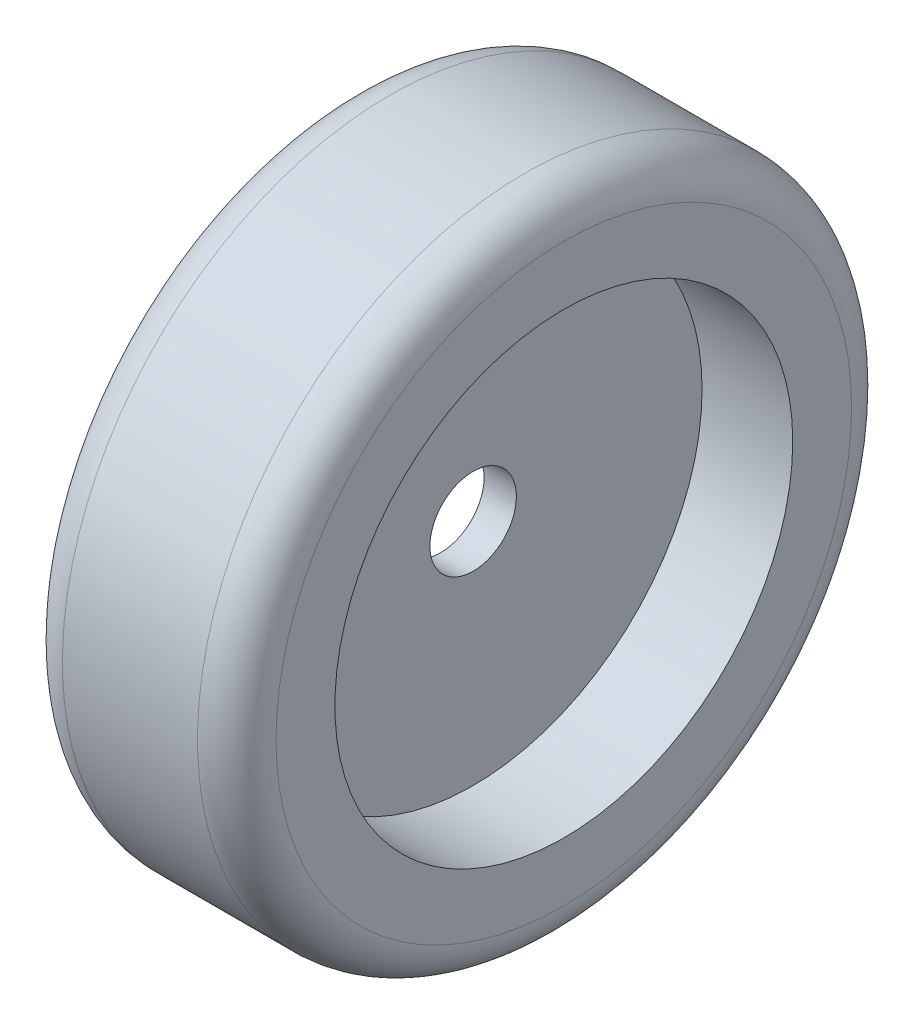
ISO-10303-21;
HEADER;
FILE_DESCRIPTION(('STEP AP214'),'2;1');
FILE_NAME('part.step','',(''),(''),'','','');
FILE_SCHEMA(('AUTOMOTIVE_DESIGN { 1 0 10303 214 1 1 1 1 }'));
ENDSEC;
DATA;
#1=APPLICATION_CONTEXT('core data for automotive mechanical design processes');
#2=APPLICATION_PROTOCOL_DEFINITION('international standard','automotive_design',2000,#1);
#3=PRODUCT_CONTEXT('',#1,'mechanical');
#4=PRODUCT('Part','Part','',(#3));
#5=PRODUCT_RELATED_PRODUCT_CATEGORY('part','',(#4));
#6=PRODUCT_DEFINITION_FORMATION('','',#4);
#7=PRODUCT_DEFINITION_CONTEXT('part definition',#1,'design');
#8=PRODUCT_DEFINITION('design','',#6,#7);
#9=PRODUCT_DEFINITION_SHAPE('','',#8);
#10=(LENGTH_UNIT() NAMED_UNIT(*) SI_UNIT(.MILLI.,.METRE.));
#11=(NAMED_UNIT(*) PLANE_ANGLE_UNIT() SI_UNIT($,.RADIAN.));
#12=(NAMED_UNIT(*) SI_UNIT($,.STERADIAN.) SOLID_ANGLE_UNIT());
#13=UNCERTAINTY_MEASURE_WITH_UNIT(LENGTH_MEASURE(1.E-05),#10,'distance_accuracy_value','');
#14=(GEOMETRIC_REPRESENTATION_CONTEXT(3) GLOBAL_UNCERTAINTY_ASSIGNED_CONTEXT((#13)) GLOBAL_UNIT_ASSIGNED_CONTEXT((#10,
#11,#12)) REPRESENTATION_CONTEXT('',''));
#15=CARTESIAN_POINT('',(0.,0.,0.));
#16=DIRECTION('',(0.,0.,1.));
#17=DIRECTION('',(1.,0.,0.));
#18=AXIS2_PLACEMENT_3D('',#15,#16,#17);
#19=CARTESIAN_POINT('',(82.9564,0.,0.));
#20=DIRECTION('',(-1.,0.,0.));
#21=DIRECTION('',(0.,0.,1.));
#22=AXIS2_PLACEMENT_3D('',#19,#20,#21);
#23=CYLINDRICAL_SURFACE('',#22,16.7894);
#24=CARTESIAN_POINT('',(47.752,0.,0.));
#25=DIRECTION('',(1.,0.,0.));
#26=DIRECTION('',(0.,0.,-1.));
#27=AXIS2_PLACEMENT_3D('',#24,#25,#26);
#28=CIRCLE('',#27,16.7894);
#29=CARTESIAN_POINT('',(47.752,0.,-16.7894));
#30=VERTEX_POINT('',#29);
#31=EDGE_CURVE('E70',#30,#30,#28,.T.);
#32=ORIENTED_EDGE('',*,*,#31,.T.);
#33=EDGE_LOOP('',(#32));
#34=FACE_BOUND('',#33,.T.);
#35=CARTESIAN_POINT('',(35.2044,0.,0.));
#36=DIRECTION('',(1.,0.,0.));
#37=DIRECTION('',(0.,0.,-1.));
#38=AXIS2_PLACEMENT_3D('',#35,#36,#37);
#39=CIRCLE('',#38,16.7894);
#40=CARTESIAN_POINT('',(35.2044,0.,-16.7894));
#41=VERTEX_POINT('',#40);
#42=EDGE_CURVE('E82',#41,#41,#39,.T.);
#43=ORIENTED_EDGE('',*,*,#42,.F.);
#44=EDGE_LOOP('',(#43));
#45=FACE_BOUND('',#44,.T.);
#46=ADVANCED_FACE('F41',(#34,#45),#23,.F.);
#47=CARTESIAN_POINT('',(0.,0.,0.));
#48=DIRECTION('',(1.,0.,0.));
#49=DIRECTION('',(0.,0.,-1.));
#50=AXIS2_PLACEMENT_3D('',#47,#48,#49);
#51=PLANE('',#50);
#52=CARTESIAN_POINT('',(0.,0.,0.));
#53=DIRECTION('',(1.,0.,0.));
#54=DIRECTION('',(0.,0.,-1.));
#55=AXIS2_PLACEMENT_3D('',#52,#53,#54);
#56=CIRCLE('',#55,111.76);
#57=CARTESIAN_POINT('',(0.,0.,-111.76));
#58=VERTEX_POINT('',#57);
#59=EDGE_CURVE('E10',#58,#58,#56,.F.);
#60=ORIENTED_EDGE('',*,*,#59,.T.);
#61=EDGE_LOOP('',(#60));
#62=FACE_BOUND('',#61,.T.);
#63=CARTESIAN_POINT('',(0.,0.,0.));
#64=DIRECTION('',(1.,0.,0.));
#65=DIRECTION('',(0.,0.,-1.));
#66=AXIS2_PLACEMENT_3D('',#63,#64,#65);
#67=CIRCLE('',#66,88.9);
#68=CARTESIAN_POINT('',(0.,0.,-88.9));
#69=VERTEX_POINT('',#68);
#70=EDGE_CURVE('E78',#69,#69,#67,.T.);
#71=ORIENTED_EDGE('',*,*,#70,.T.);
#72=EDGE_LOOP('',(#71));
#73=FACE_BOUND('',#72,.T.);
#74=ADVANCED_FACE('F93',(#62,#73),#51,.F.);
#75=CARTESIAN_POINT('',(82.9564,0.,0.));
#76=DIRECTION('',(1.,0.,0.));
#77=DIRECTION('',(0.,0.,-1.));
#78=AXIS2_PLACEMENT_3D('',#75,#76,#77);
#79=PLANE('',#78);
#80=CARTESIAN_POINT('',(82.9564,0.,0.));
#81=DIRECTION('',(1.,0.,0.));
#82=DIRECTION('',(0.,0.,-1.));
#83=AXIS2_PLACEMENT_3D('',#80,#81,#82);
#84=CIRCLE('',#83,88.9);
#85=CARTESIAN_POINT('',(82.9564,0.,-88.9));
#86=VERTEX_POINT('',#85);
#87=EDGE_CURVE('E66',#86,#86,#84,.T.);
#88=ORIENTED_EDGE('',*,*,#87,.F.);
#89=EDGE_LOOP('',(#88));
#90=FACE_BOUND('',#89,.T.);
#91=CARTESIAN_POINT('',(82.9564,0.,0.));
#92=DIRECTION('',(1.,0.,0.));
#93=DIRECTION('',(0.,0.,-1.));
#94=AXIS2_PLACEMENT_3D('',#91,#92,#93);
#95=CIRCLE('',#94,111.76);
#96=CARTESIAN_POINT('',(82.9564,0.,-111.76));
#97=VERTEX_POINT('',#96);
#98=EDGE_CURVE('E59',#97,#97,#95,.T.);
#99=ORIENTED_EDGE('',*,*,#98,.T.);
#100=EDGE_LOOP('',(#99));
#101=FACE_BOUND('',#100,.T.);
#102=ADVANCED_FACE('F99',(#90,#101),#79,.T.);
#103=CARTESIAN_POINT('',(82.9564,0.,0.));
#104=DIRECTION('',(-1.,0.,0.));
#105=DIRECTION('',(0.,0.,1.));
#106=AXIS2_PLACEMENT_3D('',#103,#104,#105);
#107=CYLINDRICAL_SURFACE('',#106,127.);
#108=CARTESIAN_POINT('',(67.7164,0.,0.));
#109=DIRECTION('',(1.,0.,0.));
#110=DIRECTION('',(0.,0.,-1.));
#111=AXIS2_PLACEMENT_3D('',#108,#109,#110);
#112=CIRCLE('',#111,127.);
#113=CARTESIAN_POINT('',(67.7164,0.,-127.));
#114=VERTEX_POINT('',#113);
#115=EDGE_CURVE('E49',#114,#114,#112,.F.);
#116=ORIENTED_EDGE('',*,*,#115,.T.);
#117=EDGE_LOOP('',(#116));
#118=FACE_BOUND('',#117,.T.);
#119=CARTESIAN_POINT('',(15.24,0.,0.));
#120=DIRECTION('',(1.,0.,0.));
#121=DIRECTION('',(0.,0.,-1.));
#122=AXIS2_PLACEMENT_3D('',#119,#120,#121);
#123=CIRCLE('',#122,127.);
#124=CARTESIAN_POINT('',(15.24,0.,-127.));
#125=VERTEX_POINT('',#124);
#126=EDGE_CURVE('E54',#125,#125,#123,.T.);
#127=ORIENTED_EDGE('',*,*,#126,.T.);
#128=EDGE_LOOP('',(#127));
#129=FACE_BOUND('',#128,.T.);
#130=ADVANCED_FACE('F106',(#118,#129),#107,.T.);
#131=CARTESIAN_POINT('',(67.7164,0.,0.));
#132=DIRECTION('',(1.,0.,0.));
#133=DIRECTION('',(0.,0.,-1.));
#134=AXIS2_PLACEMENT_3D('',#131,#132,#133);
#135=TOROIDAL_SURFACE('',#134,111.76,15.24);
#136=ORIENTED_EDGE('',*,*,#115,.F.);
#137=EDGE_LOOP('',(#136));
#138=FACE_BOUND('',#137,.T.);
#139=ORIENTED_EDGE('',*,*,#98,.F.);
#140=EDGE_LOOP('',(#139));
#141=FACE_BOUND('',#140,.T.);
#142=ADVANCED_FACE('F110',(#138,#141),#135,.T.);
#143=CARTESIAN_POINT('',(15.24,0.,0.));
#144=DIRECTION('',(1.,0.,0.));
#145=DIRECTION('',(0.,0.,-1.));
#146=AXIS2_PLACEMENT_3D('',#143,#144,#145);
#147=TOROIDAL_SURFACE('',#146,111.76,15.24);
#148=ORIENTED_EDGE('',*,*,#59,.F.);
#149=EDGE_LOOP('',(#148));
#150=FACE_BOUND('',#149,.T.);
#151=ORIENTED_EDGE('',*,*,#126,.F.);
#152=EDGE_LOOP('',(#151));
#153=FACE_BOUND('',#152,.T.);
#154=ADVANCED_FACE('F43',(#150,#153),#147,.T.);
#155=CARTESIAN_POINT('',(47.752,0.,0.));
#156=DIRECTION('',(1.,0.,0.));
#157=DIRECTION('',(0.,0.,-1.));
#158=AXIS2_PLACEMENT_3D('',#155,#156,#157);
#159=CYLINDRICAL_SURFACE('',#158,88.9);
#160=CARTESIAN_POINT('',(47.752,0.,0.));
#161=DIRECTION('',(1.,0.,0.));
#162=DIRECTION('',(0.,0.,-1.));
#163=AXIS2_PLACEMENT_3D('',#160,#161,#162);
#164=CIRCLE('',#163,88.9);
#165=CARTESIAN_POINT('',(47.752,0.,-88.9));
#166=VERTEX_POINT('',#165);
#167=EDGE_CURVE('E65',#166,#166,#164,.T.);
#168=ORIENTED_EDGE('',*,*,#167,.F.);
#169=EDGE_LOOP('',(#168));
#170=FACE_BOUND('',#169,.T.);
#171=ORIENTED_EDGE('',*,*,#87,.T.);
#172=EDGE_LOOP('',(#171));
#173=FACE_BOUND('',#172,.T.);
#174=ADVANCED_FACE('F103',(#170,#173),#159,.F.);
#175=CARTESIAN_POINT('',(47.752,0.,0.));
#176=DIRECTION('',(1.,0.,0.));
#177=DIRECTION('',(0.,0.,-1.));
#178=AXIS2_PLACEMENT_3D('',#175,#176,#177);
#179=PLANE('',#178);
#180=ORIENTED_EDGE('',*,*,#31,.F.);
#181=EDGE_LOOP('',(#180));
#182=FACE_BOUND('',#181,.T.);
#183=ORIENTED_EDGE('',*,*,#167,.T.);
#184=EDGE_LOOP('',(#183));
#185=FACE_BOUND('',#184,.T.);
#186=ADVANCED_FACE('F123',(#182,#185),#179,.T.);
#187=CARTESIAN_POINT('',(35.2044,0.,0.));
#188=DIRECTION('',(-1.,0.,0.));
#189=DIRECTION('',(0.,0.,-1.));
#190=AXIS2_PLACEMENT_3D('',#187,#188,#189);
#191=PLANE('',#190);
#192=CARTESIAN_POINT('',(35.2044,0.,0.));
#193=DIRECTION('',(1.,0.,0.));
#194=DIRECTION('',(0.,0.,-1.));
#195=AXIS2_PLACEMENT_3D('',#192,#193,#194);
#196=CIRCLE('',#195,88.9);
#197=CARTESIAN_POINT('',(35.2044,0.,-88.9));
#198=VERTEX_POINT('',#197);
#199=EDGE_CURVE('E77',#198,#198,#196,.T.);
#200=ORIENTED_EDGE('',*,*,#199,.F.);
#201=EDGE_LOOP('',(#200));
#202=FACE_BOUND('',#201,.T.);
#203=ORIENTED_EDGE('',*,*,#42,.T.);
#204=EDGE_LOOP('',(#203));
#205=FACE_BOUND('',#204,.T.);
#206=ADVANCED_FACE('F90',(#202,#205),#191,.T.);
#207=CARTESIAN_POINT('',(35.2044,0.,0.));
#208=DIRECTION('',(-1.,0.,0.));
#209=DIRECTION('',(0.,0.,1.));
#210=AXIS2_PLACEMENT_3D('',#207,#208,#209);
#211=CYLINDRICAL_SURFACE('',#210,88.9);
#212=ORIENTED_EDGE('',*,*,#199,.T.);
#213=EDGE_LOOP('',(#212));
#214=FACE_BOUND('',#213,.T.);
#215=ORIENTED_EDGE('',*,*,#70,.F.);
#216=EDGE_LOOP('',(#215));
#217=FACE_BOUND('',#216,.T.);
#218=ADVANCED_FACE('F139',(#214,#217),#211,.F.);
#219=CLOSED_SHELL('',(#46,#74,#102,#130,#142,#154,#174,#186,#206,#218));
#220=MANIFOLD_SOLID_BREP('B2',#219);
#221=ADVANCED_BREP_SHAPE_REPRESENTATION('',(#18,#220),#14);
#222=SHAPE_DEFINITION_REPRESENTATION(#9,#221);
ENDSEC;
END-ISO-10303-21;
